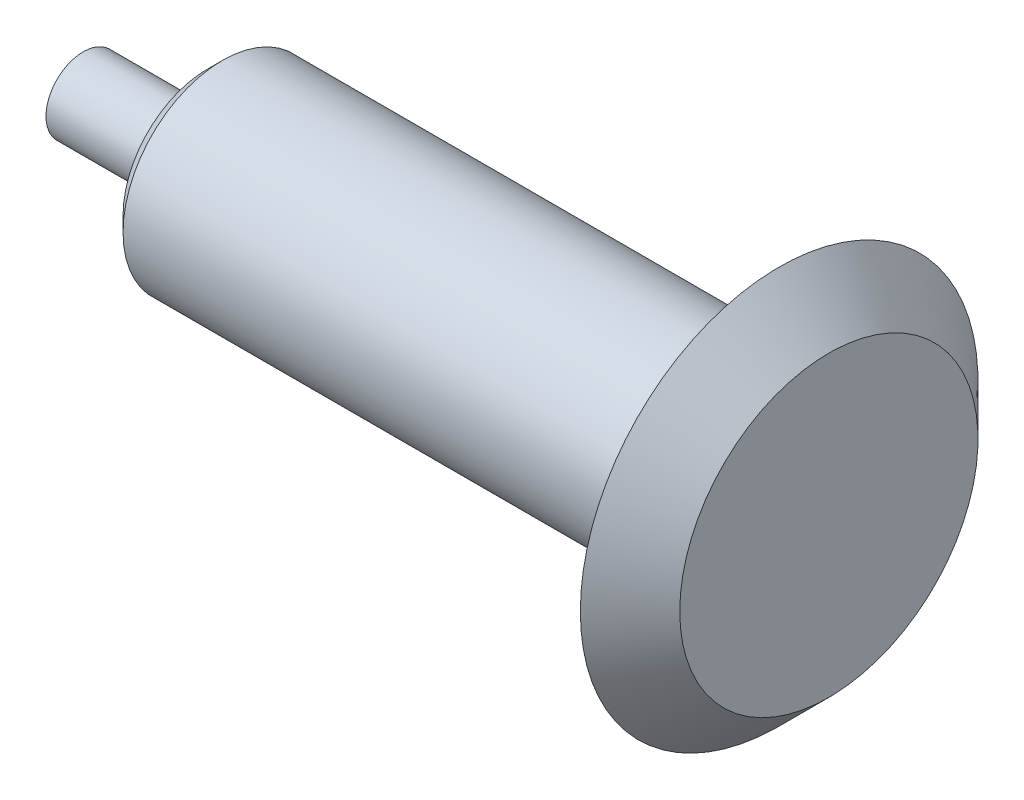
ISO-10303-21;
HEADER;
FILE_DESCRIPTION(('STEP AP214'),'2;1');
FILE_NAME('part.step','',(''),(''),'','','');
FILE_SCHEMA(('AUTOMOTIVE_DESIGN { 1 0 10303 214 1 1 1 1 }'));
ENDSEC;
DATA;
#1=APPLICATION_CONTEXT('core data for automotive mechanical design processes');
#2=APPLICATION_PROTOCOL_DEFINITION('international standard','automotive_design',2000,#1);
#3=PRODUCT_CONTEXT('',#1,'mechanical');
#4=PRODUCT('Part','Part','',(#3));
#5=PRODUCT_RELATED_PRODUCT_CATEGORY('part','',(#4));
#6=PRODUCT_DEFINITION_FORMATION('','',#4);
#7=PRODUCT_DEFINITION_CONTEXT('part definition',#1,'design');
#8=PRODUCT_DEFINITION('design','',#6,#7);
#9=PRODUCT_DEFINITION_SHAPE('','',#8);
#10=(LENGTH_UNIT() NAMED_UNIT(*) SI_UNIT(.MILLI.,.METRE.));
#11=(NAMED_UNIT(*) PLANE_ANGLE_UNIT() SI_UNIT($,.RADIAN.));
#12=(NAMED_UNIT(*) SI_UNIT($,.STERADIAN.) SOLID_ANGLE_UNIT());
#13=UNCERTAINTY_MEASURE_WITH_UNIT(LENGTH_MEASURE(1.E-05),#10,'distance_accuracy_value','');
#14=(GEOMETRIC_REPRESENTATION_CONTEXT(3) GLOBAL_UNCERTAINTY_ASSIGNED_CONTEXT((#13)) GLOBAL_UNIT_ASSIGNED_CONTEXT((#10,
#11,#12)) REPRESENTATION_CONTEXT('',''));
#15=CARTESIAN_POINT('',(0.,0.,0.));
#16=DIRECTION('',(0.,0.,1.));
#17=DIRECTION('',(1.,0.,0.));
#18=AXIS2_PLACEMENT_3D('',#15,#16,#17);
#19=CARTESIAN_POINT('',(25.,0.,0.));
#20=DIRECTION('',(-1.,0.,0.));
#21=DIRECTION('',(0.,0.,1.));
#22=AXIS2_PLACEMENT_3D('',#19,#20,#21);
#23=CYLINDRICAL_SURFACE('',#22,7.5);
#24=CARTESIAN_POINT('',(0.,0.,0.));
#25=DIRECTION('',(-1.,0.,0.));
#26=DIRECTION('',(0.,0.,1.));
#27=AXIS2_PLACEMENT_3D('',#24,#25,#26);
#28=CIRCLE('',#27,7.5);
#29=CARTESIAN_POINT('',(0.,0.,7.5));
#30=VERTEX_POINT('',#29);
#31=EDGE_CURVE('E54',#30,#30,#28,.T.);
#32=ORIENTED_EDGE('',*,*,#31,.F.);
#33=EDGE_LOOP('',(#32));
#34=FACE_BOUND('',#33,.T.);
#35=CARTESIAN_POINT('',(25.,0.,0.));
#36=DIRECTION('',(-1.,0.,0.));
#37=DIRECTION('',(0.,0.,1.));
#38=AXIS2_PLACEMENT_3D('',#35,#36,#37);
#39=CIRCLE('',#38,7.5);
#40=CARTESIAN_POINT('',(25.,0.,7.5));
#41=VERTEX_POINT('',#40);
#42=EDGE_CURVE('E60',#41,#41,#39,.T.);
#43=ORIENTED_EDGE('',*,*,#42,.T.);
#44=EDGE_LOOP('',(#43));
#45=FACE_BOUND('',#44,.T.);
#46=ADVANCED_FACE('F31',(#34,#45),#23,.T.);
#47=CARTESIAN_POINT('',(0.,0.,0.));
#48=DIRECTION('',(1.,0.,0.));
#49=DIRECTION('',(0.,0.,-1.));
#50=AXIS2_PLACEMENT_3D('',#47,#48,#49);
#51=PLANE('',#50);
#52=ORIENTED_EDGE('',*,*,#31,.T.);
#53=EDGE_LOOP('',(#52));
#54=FACE_BOUND('',#53,.T.);
#55=ADVANCED_FACE('F80',(#54),#51,.F.);
#56=CARTESIAN_POINT('',(150.,0.,0.));
#57=DIRECTION('',(-1.,0.,0.));
#58=DIRECTION('',(0.,0.,1.));
#59=AXIS2_PLACEMENT_3D('',#56,#57,#58);
#60=PLANE('',#59);
#61=CARTESIAN_POINT('',(150.,0.,0.));
#62=DIRECTION('',(-1.,0.,0.));
#63=DIRECTION('',(0.,0.,1.));
#64=AXIS2_PLACEMENT_3D('',#61,#62,#63);
#65=CIRCLE('',#64,30.);
#66=CARTESIAN_POINT('',(150.,0.,30.));
#67=VERTEX_POINT('',#66);
#68=EDGE_CURVE('E51',#67,#67,#65,.F.);
#69=ORIENTED_EDGE('',*,*,#68,.T.);
#70=EDGE_LOOP('',(#69));
#71=FACE_BOUND('',#70,.T.);
#72=ADVANCED_FACE('F86',(#71),#60,.F.);
#73=CARTESIAN_POINT('',(140.,0.,0.));
#74=DIRECTION('',(1.,0.,0.));
#75=DIRECTION('',(0.,0.,-1.));
#76=AXIS2_PLACEMENT_3D('',#73,#74,#75);
#77=PLANE('',#76);
#78=CARTESIAN_POINT('',(140.,0.,0.));
#79=DIRECTION('',(1.,0.,0.));
#80=DIRECTION('',(0.,0.,-1.));
#81=AXIS2_PLACEMENT_3D('',#78,#79,#80);
#82=CIRCLE('',#81,30.);
#83=CARTESIAN_POINT('',(140.,0.,-30.));
#84=VERTEX_POINT('',#83);
#85=EDGE_CURVE('E42',#84,#84,#82,.T.);
#86=ORIENTED_EDGE('',*,*,#85,.T.);
#87=EDGE_LOOP('',(#86));
#88=FACE_BOUND('',#87,.T.);
#89=CARTESIAN_POINT('',(140.,0.,0.));
#90=DIRECTION('',(-1.,0.,0.));
#91=DIRECTION('',(0.,0.,1.));
#92=AXIS2_PLACEMENT_3D('',#89,#90,#91);
#93=CIRCLE('',#92,40.);
#94=CARTESIAN_POINT('',(140.,0.,40.));
#95=VERTEX_POINT('',#94);
#96=EDGE_CURVE('E57',#95,#95,#93,.T.);
#97=ORIENTED_EDGE('',*,*,#96,.T.);
#98=EDGE_LOOP('',(#97));
#99=FACE_BOUND('',#98,.T.);
#100=ADVANCED_FACE('F77',(#88,#99),#77,.F.);
#101=CARTESIAN_POINT('',(25.,0.,0.));
#102=DIRECTION('',(-1.,0.,0.));
#103=DIRECTION('',(0.,0.,1.));
#104=AXIS2_PLACEMENT_3D('',#101,#102,#103);
#105=CYLINDRICAL_SURFACE('',#104,20.);
#106=CARTESIAN_POINT('',(28.,0.,0.));
#107=DIRECTION('',(-1.,0.,0.));
#108=DIRECTION('',(0.,0.,1.));
#109=AXIS2_PLACEMENT_3D('',#106,#107,#108);
#110=CIRCLE('',#109,20.);
#111=CARTESIAN_POINT('',(28.,0.,20.));
#112=VERTEX_POINT('',#111);
#113=EDGE_CURVE('E10',#112,#112,#110,.F.);
#114=ORIENTED_EDGE('',*,*,#113,.T.);
#115=EDGE_LOOP('',(#114));
#116=FACE_BOUND('',#115,.T.);
#117=CARTESIAN_POINT('',(130.,0.,0.));
#118=DIRECTION('',(1.,0.,0.));
#119=DIRECTION('',(0.,0.,-1.));
#120=AXIS2_PLACEMENT_3D('',#117,#118,#119);
#121=CIRCLE('',#120,20.);
#122=CARTESIAN_POINT('',(130.,0.,-20.));
#123=VERTEX_POINT('',#122);
#124=EDGE_CURVE('E46',#123,#123,#121,.F.);
#125=ORIENTED_EDGE('',*,*,#124,.T.);
#126=EDGE_LOOP('',(#125));
#127=FACE_BOUND('',#126,.T.);
#128=ADVANCED_FACE('F68',(#116,#127),#105,.T.);
#129=CARTESIAN_POINT('',(25.,0.,0.));
#130=DIRECTION('',(-1.,0.,0.));
#131=DIRECTION('',(0.,0.,1.));
#132=AXIS2_PLACEMENT_3D('',#129,#130,#131);
#133=PLANE('',#132);
#134=CARTESIAN_POINT('',(25.,0.,0.));
#135=DIRECTION('',(-1.,0.,0.));
#136=DIRECTION('',(0.,0.,1.));
#137=AXIS2_PLACEMENT_3D('',#134,#135,#136);
#138=CIRCLE('',#137,17.);
#139=CARTESIAN_POINT('',(25.,0.,17.));
#140=VERTEX_POINT('',#139);
#141=EDGE_CURVE('E38',#140,#140,#138,.T.);
#142=ORIENTED_EDGE('',*,*,#141,.T.);
#143=EDGE_LOOP('',(#142));
#144=FACE_BOUND('',#143,.T.);
#145=ORIENTED_EDGE('',*,*,#42,.F.);
#146=EDGE_LOOP('',(#145));
#147=FACE_BOUND('',#146,.T.);
#148=ADVANCED_FACE('F65',(#144,#147),#133,.T.);
#149=CARTESIAN_POINT('',(140.,0.,0.));
#150=DIRECTION('',(-1.,0.,0.));
#151=DIRECTION('',(0.,0.,1.));
#152=AXIS2_PLACEMENT_3D('',#149,#150,#151);
#153=CONICAL_SURFACE('',#152,40.,0.785398163397447);
#154=ORIENTED_EDGE('',*,*,#68,.F.);
#155=EDGE_LOOP('',(#154));
#156=FACE_BOUND('',#155,.T.);
#157=ORIENTED_EDGE('',*,*,#96,.F.);
#158=EDGE_LOOP('',(#157));
#159=FACE_BOUND('',#158,.T.);
#160=ADVANCED_FACE('F67',(#156,#159),#153,.T.);
#161=CARTESIAN_POINT('',(130.,0.,0.));
#162=DIRECTION('',(1.,0.,0.));
#163=DIRECTION('',(0.,0.,-1.));
#164=AXIS2_PLACEMENT_3D('',#161,#162,#163);
#165=CONICAL_SURFACE('',#164,20.,0.785398163397449);
#166=ORIENTED_EDGE('',*,*,#85,.F.);
#167=EDGE_LOOP('',(#166));
#168=FACE_BOUND('',#167,.T.);
#169=ORIENTED_EDGE('',*,*,#124,.F.);
#170=EDGE_LOOP('',(#169));
#171=FACE_BOUND('',#170,.T.);
#172=ADVANCED_FACE('F74',(#168,#171),#165,.T.);
#173=CARTESIAN_POINT('',(25.,0.,0.));
#174=DIRECTION('',(1.,0.,0.));
#175=DIRECTION('',(0.,0.,-1.));
#176=AXIS2_PLACEMENT_3D('',#173,#174,#175);
#177=CONICAL_SURFACE('',#176,17.,0.785398163397448);
#178=ORIENTED_EDGE('',*,*,#113,.F.);
#179=EDGE_LOOP('',(#178));
#180=FACE_BOUND('',#179,.T.);
#181=ORIENTED_EDGE('',*,*,#141,.F.);
#182=EDGE_LOOP('',(#181));
#183=FACE_BOUND('',#182,.T.);
#184=ADVANCED_FACE('F33',(#180,#183),#177,.T.);
#185=CLOSED_SHELL('',(#46,#55,#72,#100,#128,#148,#160,#172,#184));
#186=MANIFOLD_SOLID_BREP('B2',#185);
#187=ADVANCED_BREP_SHAPE_REPRESENTATION('',(#18,#186),#14);
#188=SHAPE_DEFINITION_REPRESENTATION(#9,#187);
ENDSEC;
END-ISO-10303-21;
